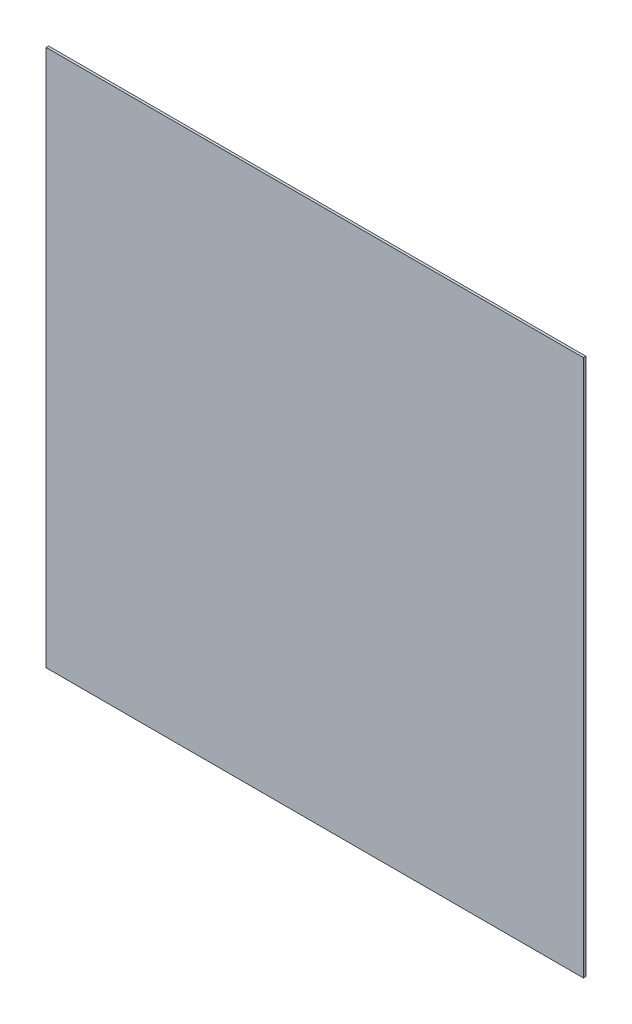
ISO-10303-21;
HEADER;
FILE_DESCRIPTION(('STEP AP214'),'2;1');
FILE_NAME('part.step','',(''),(''),'','','');
FILE_SCHEMA(('AUTOMOTIVE_DESIGN { 1 0 10303 214 1 1 1 1 }'));
ENDSEC;
DATA;
#1=APPLICATION_CONTEXT('core data for automotive mechanical design processes');
#2=APPLICATION_PROTOCOL_DEFINITION('international standard','automotive_design',2000,#1);
#3=PRODUCT_CONTEXT('',#1,'mechanical');
#4=PRODUCT('Part','Part','',(#3));
#5=PRODUCT_RELATED_PRODUCT_CATEGORY('part','',(#4));
#6=PRODUCT_DEFINITION_FORMATION('','',#4);
#7=PRODUCT_DEFINITION_CONTEXT('part definition',#1,'design');
#8=PRODUCT_DEFINITION('design','',#6,#7);
#9=PRODUCT_DEFINITION_SHAPE('','',#8);
#10=(LENGTH_UNIT() NAMED_UNIT(*) SI_UNIT(.MILLI.,.METRE.));
#11=(NAMED_UNIT(*) PLANE_ANGLE_UNIT() SI_UNIT($,.RADIAN.));
#12=(NAMED_UNIT(*) SI_UNIT($,.STERADIAN.) SOLID_ANGLE_UNIT());
#13=UNCERTAINTY_MEASURE_WITH_UNIT(LENGTH_MEASURE(1.E-05),#10,'distance_accuracy_value','');
#14=(GEOMETRIC_REPRESENTATION_CONTEXT(3) GLOBAL_UNCERTAINTY_ASSIGNED_CONTEXT((#13)) GLOBAL_UNIT_ASSIGNED_CONTEXT((#10,
#11,#12)) REPRESENTATION_CONTEXT('',''));
#15=CARTESIAN_POINT('',(0.,0.,0.));
#16=DIRECTION('',(0.,0.,1.));
#17=DIRECTION('',(1.,0.,0.));
#18=AXIS2_PLACEMENT_3D('',#15,#16,#17);
#19=CARTESIAN_POINT('',(11000.,-11000.,100.));
#20=DIRECTION('',(-1.,0.,0.));
#21=DIRECTION('',(0.,0.,1.));
#22=AXIS2_PLACEMENT_3D('',#19,#20,#21);
#23=PLANE('',#22);
#24=DIRECTION('',(0.,1.,0.));
#25=VECTOR('',#24,1.);
#26=CARTESIAN_POINT('',(11000.,-11000.,0.));
#27=LINE('',#26,#25);
#28=CARTESIAN_POINT('',(11000.,-11000.,0.));
#29=VERTEX_POINT('',#28);
#30=CARTESIAN_POINT('',(11000.,11000.,0.));
#31=VERTEX_POINT('',#30);
#32=EDGE_CURVE('E113',#29,#31,#27,.T.);
#33=ORIENTED_EDGE('',*,*,#32,.T.);
#34=DIRECTION('',(0.,0.,-1.));
#35=VECTOR('',#34,1.);
#36=CARTESIAN_POINT('',(11000.,11000.,100.));
#37=LINE('',#36,#35);
#38=CARTESIAN_POINT('',(11000.,11000.,100.));
#39=VERTEX_POINT('',#38);
#40=EDGE_CURVE('E11',#39,#31,#37,.T.);
#41=ORIENTED_EDGE('',*,*,#40,.F.);
#42=DIRECTION('',(0.,1.,0.));
#43=VECTOR('',#42,1.);
#44=CARTESIAN_POINT('',(11000.,-11000.,100.));
#45=LINE('',#44,#43);
#46=CARTESIAN_POINT('',(11000.,-11000.,100.));
#47=VERTEX_POINT('',#46);
#48=EDGE_CURVE('E97',#47,#39,#45,.T.);
#49=ORIENTED_EDGE('',*,*,#48,.F.);
#50=DIRECTION('',(0.,0.,-1.));
#51=VECTOR('',#50,1.);
#52=CARTESIAN_POINT('',(11000.,-11000.,100.));
#53=LINE('',#52,#51);
#54=EDGE_CURVE('E109',#47,#29,#53,.T.);
#55=ORIENTED_EDGE('',*,*,#54,.T.);
#56=EDGE_LOOP('',(#33,#41,#49,#55));
#57=FACE_BOUND('',#56,.T.);
#58=ADVANCED_FACE('F45',(#57),#23,.F.);
#59=CARTESIAN_POINT('',(-11000.,11000.,100.));
#60=DIRECTION('',(0.,-1.,0.));
#61=DIRECTION('',(0.,0.,-1.));
#62=AXIS2_PLACEMENT_3D('',#59,#60,#61);
#63=PLANE('',#62);
#64=DIRECTION('',(-1.,0.,0.));
#65=VECTOR('',#64,1.);
#66=CARTESIAN_POINT('',(-11000.,11000.,0.));
#67=LINE('',#66,#65);
#68=CARTESIAN_POINT('',(-11000.,11000.,0.));
#69=VERTEX_POINT('',#68);
#70=EDGE_CURVE('E102',#31,#69,#67,.T.);
#71=ORIENTED_EDGE('',*,*,#70,.T.);
#72=DIRECTION('',(0.,0.,-1.));
#73=VECTOR('',#72,1.);
#74=CARTESIAN_POINT('',(-11000.,11000.,100.));
#75=LINE('',#74,#73);
#76=CARTESIAN_POINT('',(-11000.,11000.,100.));
#77=VERTEX_POINT('',#76);
#78=EDGE_CURVE('E54',#77,#69,#75,.T.);
#79=ORIENTED_EDGE('',*,*,#78,.F.);
#80=DIRECTION('',(-1.,0.,0.));
#81=VECTOR('',#80,1.);
#82=CARTESIAN_POINT('',(-11000.,11000.,100.));
#83=LINE('',#82,#81);
#84=EDGE_CURVE('E92',#39,#77,#83,.T.);
#85=ORIENTED_EDGE('',*,*,#84,.F.);
#86=ORIENTED_EDGE('',*,*,#40,.T.);
#87=EDGE_LOOP('',(#71,#79,#85,#86));
#88=FACE_BOUND('',#87,.T.);
#89=ADVANCED_FACE('F101',(#88),#63,.F.);
#90=CARTESIAN_POINT('',(-11000.,-11000.,100.));
#91=DIRECTION('',(1.,0.,0.));
#92=DIRECTION('',(0.,0.,-1.));
#93=AXIS2_PLACEMENT_3D('',#90,#91,#92);
#94=PLANE('',#93);
#95=DIRECTION('',(0.,-1.,0.));
#96=VECTOR('',#95,1.);
#97=CARTESIAN_POINT('',(-11000.,-11000.,0.));
#98=LINE('',#97,#96);
#99=CARTESIAN_POINT('',(-11000.,-11000.,0.));
#100=VERTEX_POINT('',#99);
#101=EDGE_CURVE('E79',#69,#100,#98,.T.);
#102=ORIENTED_EDGE('',*,*,#101,.T.);
#103=DIRECTION('',(0.,0.,-1.));
#104=VECTOR('',#103,1.);
#105=CARTESIAN_POINT('',(-11000.,-11000.,100.));
#106=LINE('',#105,#104);
#107=CARTESIAN_POINT('',(-11000.,-11000.,100.));
#108=VERTEX_POINT('',#107);
#109=EDGE_CURVE('E104',#108,#100,#106,.T.);
#110=ORIENTED_EDGE('',*,*,#109,.F.);
#111=DIRECTION('',(0.,-1.,0.));
#112=VECTOR('',#111,1.);
#113=CARTESIAN_POINT('',(-11000.,-11000.,100.));
#114=LINE('',#113,#112);
#115=EDGE_CURVE('E95',#77,#108,#114,.T.);
#116=ORIENTED_EDGE('',*,*,#115,.F.);
#117=ORIENTED_EDGE('',*,*,#78,.T.);
#118=EDGE_LOOP('',(#102,#110,#116,#117));
#119=FACE_BOUND('',#118,.T.);
#120=ADVANCED_FACE('F105',(#119),#94,.F.);
#121=CARTESIAN_POINT('',(-11000.,-11000.,100.));
#122=DIRECTION('',(0.,1.,0.));
#123=DIRECTION('',(0.,0.,1.));
#124=AXIS2_PLACEMENT_3D('',#121,#122,#123);
#125=PLANE('',#124);
#126=DIRECTION('',(1.,0.,0.));
#127=VECTOR('',#126,1.);
#128=CARTESIAN_POINT('',(-11000.,-11000.,0.));
#129=LINE('',#128,#127);
#130=EDGE_CURVE('E85',#100,#29,#129,.T.);
#131=ORIENTED_EDGE('',*,*,#130,.T.);
#132=ORIENTED_EDGE('',*,*,#54,.F.);
#133=DIRECTION('',(1.,0.,0.));
#134=VECTOR('',#133,1.);
#135=CARTESIAN_POINT('',(-11000.,-11000.,100.));
#136=LINE('',#135,#134);
#137=EDGE_CURVE('E62',#108,#47,#136,.T.);
#138=ORIENTED_EDGE('',*,*,#137,.F.);
#139=ORIENTED_EDGE('',*,*,#109,.T.);
#140=EDGE_LOOP('',(#131,#132,#138,#139));
#141=FACE_BOUND('',#140,.T.);
#142=ADVANCED_FACE('F126',(#141),#125,.F.);
#143=CARTESIAN_POINT('',(0.,0.,100.));
#144=DIRECTION('',(0.,0.,-1.));
#145=DIRECTION('',(-1.,0.,0.));
#146=AXIS2_PLACEMENT_3D('',#143,#144,#145);
#147=PLANE('',#146);
#148=ORIENTED_EDGE('',*,*,#48,.T.);
#149=ORIENTED_EDGE('',*,*,#84,.T.);
#150=ORIENTED_EDGE('',*,*,#115,.T.);
#151=ORIENTED_EDGE('',*,*,#137,.T.);
#152=EDGE_LOOP('',(#148,#149,#150,#151));
#153=FACE_BOUND('',#152,.T.);
#154=ADVANCED_FACE('F93',(#153),#147,.F.);
#155=CARTESIAN_POINT('',(0.,0.,0.));
#156=DIRECTION('',(0.,0.,-1.));
#157=DIRECTION('',(-1.,0.,0.));
#158=AXIS2_PLACEMENT_3D('',#155,#156,#157);
#159=PLANE('',#158);
#160=ORIENTED_EDGE('',*,*,#32,.F.);
#161=ORIENTED_EDGE('',*,*,#130,.F.);
#162=ORIENTED_EDGE('',*,*,#101,.F.);
#163=ORIENTED_EDGE('',*,*,#70,.F.);
#164=EDGE_LOOP('',(#160,#161,#162,#163));
#165=FACE_BOUND('',#164,.T.);
#166=ADVANCED_FACE('F129',(#165),#159,.T.);
#167=CLOSED_SHELL('',(#58,#89,#120,#142,#154,#166));
#168=MANIFOLD_SOLID_BREP('B2',#167);
#169=ADVANCED_BREP_SHAPE_REPRESENTATION('',(#18,#168),#14);
#170=SHAPE_DEFINITION_REPRESENTATION(#9,#169);
ENDSEC;
END-ISO-10303-21;
